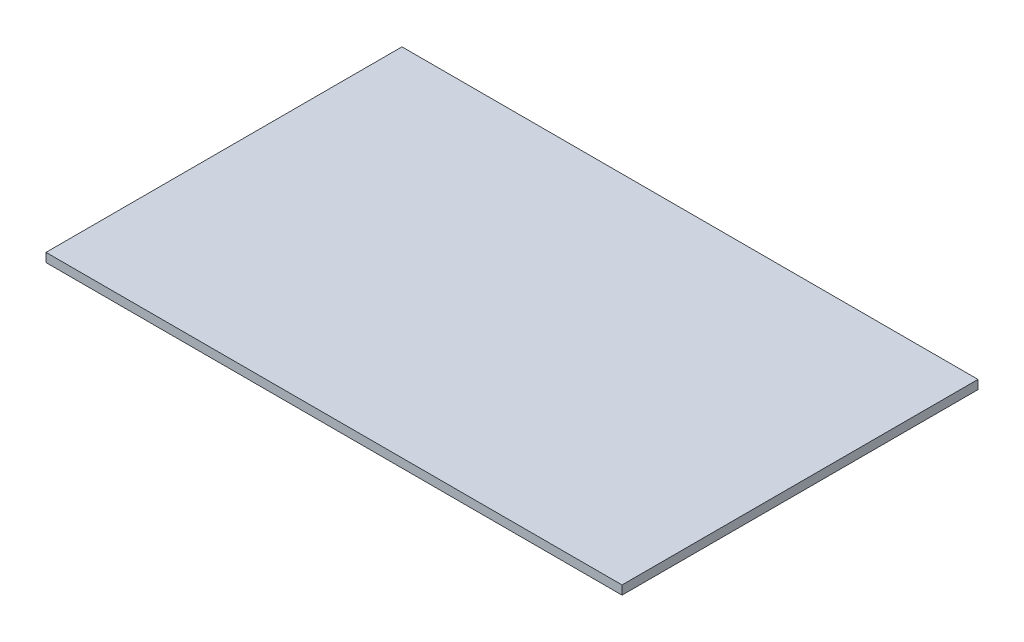
ISO-10303-21;
HEADER;
FILE_DESCRIPTION(('STEP AP214'),'2;1');
FILE_NAME('part.step','',(''),(''),'','','');
FILE_SCHEMA(('AUTOMOTIVE_DESIGN { 1 0 10303 214 1 1 1 1 }'));
ENDSEC;
DATA;
#1=APPLICATION_CONTEXT('core data for automotive mechanical design processes');
#2=APPLICATION_PROTOCOL_DEFINITION('international standard','automotive_design',2000,#1);
#3=PRODUCT_CONTEXT('',#1,'mechanical');
#4=PRODUCT('Part','Part','',(#3));
#5=PRODUCT_RELATED_PRODUCT_CATEGORY('part','',(#4));
#6=PRODUCT_DEFINITION_FORMATION('','',#4);
#7=PRODUCT_DEFINITION_CONTEXT('part definition',#1,'design');
#8=PRODUCT_DEFINITION('design','',#6,#7);
#9=PRODUCT_DEFINITION_SHAPE('','',#8);
#10=(LENGTH_UNIT() NAMED_UNIT(*) SI_UNIT(.MILLI.,.METRE.));
#11=(NAMED_UNIT(*) PLANE_ANGLE_UNIT() SI_UNIT($,.RADIAN.));
#12=(NAMED_UNIT(*) SI_UNIT($,.STERADIAN.) SOLID_ANGLE_UNIT());
#13=UNCERTAINTY_MEASURE_WITH_UNIT(LENGTH_MEASURE(1.E-05),#10,'distance_accuracy_value','');
#14=(GEOMETRIC_REPRESENTATION_CONTEXT(3) GLOBAL_UNCERTAINTY_ASSIGNED_CONTEXT((#13)) GLOBAL_UNIT_ASSIGNED_CONTEXT((#10,
#11,#12)) REPRESENTATION_CONTEXT('',''));
#15=CARTESIAN_POINT('',(0.,0.,0.));
#16=DIRECTION('',(0.,0.,1.));
#17=DIRECTION('',(1.,0.,0.));
#18=AXIS2_PLACEMENT_3D('',#15,#16,#17);
#19=CARTESIAN_POINT('',(0.,6.35,0.));
#20=DIRECTION('',(1.,0.,0.));
#21=DIRECTION('',(0.,0.,-1.));
#22=AXIS2_PLACEMENT_3D('',#19,#20,#21);
#23=PLANE('',#22);
#24=DIRECTION('',(0.,0.,1.));
#25=VECTOR('',#24,1.);
#26=CARTESIAN_POINT('',(0.,0.,0.));
#27=LINE('',#26,#25);
#28=CARTESIAN_POINT('',(0.,0.,-254.6));
#29=VERTEX_POINT('',#28);
#30=CARTESIAN_POINT('',(0.,0.,0.));
#31=VERTEX_POINT('',#30);
#32=EDGE_CURVE('E96',#29,#31,#27,.T.);
#33=ORIENTED_EDGE('',*,*,#32,.T.);
#34=DIRECTION('',(0.,-1.,0.));
#35=VECTOR('',#34,1.);
#36=CARTESIAN_POINT('',(0.,6.35,0.));
#37=LINE('',#36,#35);
#38=CARTESIAN_POINT('',(0.,6.35,0.));
#39=VERTEX_POINT('',#38);
#40=EDGE_CURVE('E11',#39,#31,#37,.T.);
#41=ORIENTED_EDGE('',*,*,#40,.F.);
#42=DIRECTION('',(0.,0.,1.));
#43=VECTOR('',#42,1.);
#44=CARTESIAN_POINT('',(0.,6.35,0.));
#45=LINE('',#44,#43);
#46=CARTESIAN_POINT('',(0.,6.35,-254.6));
#47=VERTEX_POINT('',#46);
#48=EDGE_CURVE('E84',#47,#39,#45,.T.);
#49=ORIENTED_EDGE('',*,*,#48,.F.);
#50=DIRECTION('',(0.,-1.,0.));
#51=VECTOR('',#50,1.);
#52=CARTESIAN_POINT('',(0.,6.35,-254.6));
#53=LINE('',#52,#51);
#54=EDGE_CURVE('E92',#47,#29,#53,.T.);
#55=ORIENTED_EDGE('',*,*,#54,.T.);
#56=EDGE_LOOP('',(#33,#41,#49,#55));
#57=FACE_BOUND('',#56,.T.);
#58=ADVANCED_FACE('F33',(#57),#23,.F.);
#59=CARTESIAN_POINT('',(0.,6.35,0.));
#60=DIRECTION('',(0.,0.,-1.));
#61=DIRECTION('',(-1.,0.,0.));
#62=AXIS2_PLACEMENT_3D('',#59,#60,#61);
#63=PLANE('',#62);
#64=DIRECTION('',(1.,0.,0.));
#65=VECTOR('',#64,1.);
#66=CARTESIAN_POINT('',(0.,0.,0.));
#67=LINE('',#66,#65);
#68=CARTESIAN_POINT('',(412.,0.,0.));
#69=VERTEX_POINT('',#68);
#70=EDGE_CURVE('E88',#31,#69,#67,.T.);
#71=ORIENTED_EDGE('',*,*,#70,.T.);
#72=DIRECTION('',(0.,-1.,0.));
#73=VECTOR('',#72,1.);
#74=CARTESIAN_POINT('',(412.,6.35,0.));
#75=LINE('',#74,#73);
#76=CARTESIAN_POINT('',(412.,6.35,0.));
#77=VERTEX_POINT('',#76);
#78=EDGE_CURVE('E41',#77,#69,#75,.T.);
#79=ORIENTED_EDGE('',*,*,#78,.F.);
#80=DIRECTION('',(1.,0.,0.));
#81=VECTOR('',#80,1.);
#82=CARTESIAN_POINT('',(0.,6.35,0.));
#83=LINE('',#82,#81);
#84=EDGE_CURVE('E79',#39,#77,#83,.T.);
#85=ORIENTED_EDGE('',*,*,#84,.F.);
#86=ORIENTED_EDGE('',*,*,#40,.T.);
#87=EDGE_LOOP('',(#71,#79,#85,#86));
#88=FACE_BOUND('',#87,.T.);
#89=ADVANCED_FACE('F87',(#88),#63,.F.);
#90=CARTESIAN_POINT('',(412.,6.35,0.));
#91=DIRECTION('',(-1.,0.,0.));
#92=DIRECTION('',(0.,0.,1.));
#93=AXIS2_PLACEMENT_3D('',#90,#91,#92);
#94=PLANE('',#93);
#95=DIRECTION('',(0.,0.,-1.));
#96=VECTOR('',#95,1.);
#97=CARTESIAN_POINT('',(412.,0.,0.));
#98=LINE('',#97,#96);
#99=CARTESIAN_POINT('',(412.,0.,-254.6));
#100=VERTEX_POINT('',#99);
#101=EDGE_CURVE('E66',#69,#100,#98,.T.);
#102=ORIENTED_EDGE('',*,*,#101,.T.);
#103=DIRECTION('',(0.,-1.,0.));
#104=VECTOR('',#103,1.);
#105=CARTESIAN_POINT('',(412.,6.35,-254.6));
#106=LINE('',#105,#104);
#107=CARTESIAN_POINT('',(412.,6.35,-254.6));
#108=VERTEX_POINT('',#107);
#109=EDGE_CURVE('E89',#108,#100,#106,.T.);
#110=ORIENTED_EDGE('',*,*,#109,.F.);
#111=DIRECTION('',(0.,0.,-1.));
#112=VECTOR('',#111,1.);
#113=CARTESIAN_POINT('',(412.,6.35,0.));
#114=LINE('',#113,#112);
#115=EDGE_CURVE('E82',#77,#108,#114,.T.);
#116=ORIENTED_EDGE('',*,*,#115,.F.);
#117=ORIENTED_EDGE('',*,*,#78,.T.);
#118=EDGE_LOOP('',(#102,#110,#116,#117));
#119=FACE_BOUND('',#118,.T.);
#120=ADVANCED_FACE('F90',(#119),#94,.F.);
#121=CARTESIAN_POINT('',(0.,6.35,-254.6));
#122=DIRECTION('',(0.,0.,1.));
#123=DIRECTION('',(1.,0.,0.));
#124=AXIS2_PLACEMENT_3D('',#121,#122,#123);
#125=PLANE('',#124);
#126=DIRECTION('',(-1.,0.,0.));
#127=VECTOR('',#126,1.);
#128=CARTESIAN_POINT('',(0.,0.,-254.6));
#129=LINE('',#128,#127);
#130=EDGE_CURVE('E72',#100,#29,#129,.T.);
#131=ORIENTED_EDGE('',*,*,#130,.T.);
#132=ORIENTED_EDGE('',*,*,#54,.F.);
#133=DIRECTION('',(-1.,0.,0.));
#134=VECTOR('',#133,1.);
#135=CARTESIAN_POINT('',(0.,6.35,-254.6));
#136=LINE('',#135,#134);
#137=EDGE_CURVE('E49',#108,#47,#136,.T.);
#138=ORIENTED_EDGE('',*,*,#137,.F.);
#139=ORIENTED_EDGE('',*,*,#109,.T.);
#140=EDGE_LOOP('',(#131,#132,#138,#139));
#141=FACE_BOUND('',#140,.T.);
#142=ADVANCED_FACE('F103',(#141),#125,.F.);
#143=CARTESIAN_POINT('',(0.,6.35,0.));
#144=DIRECTION('',(0.,-1.,0.));
#145=DIRECTION('',(0.,0.,-1.));
#146=AXIS2_PLACEMENT_3D('',#143,#144,#145);
#147=PLANE('',#146);
#148=ORIENTED_EDGE('',*,*,#48,.T.);
#149=ORIENTED_EDGE('',*,*,#84,.T.);
#150=ORIENTED_EDGE('',*,*,#115,.T.);
#151=ORIENTED_EDGE('',*,*,#137,.T.);
#152=EDGE_LOOP('',(#148,#149,#150,#151));
#153=FACE_BOUND('',#152,.T.);
#154=ADVANCED_FACE('F80',(#153),#147,.F.);
#155=CARTESIAN_POINT('',(0.,0.,0.));
#156=DIRECTION('',(0.,-1.,0.));
#157=DIRECTION('',(0.,0.,-1.));
#158=AXIS2_PLACEMENT_3D('',#155,#156,#157);
#159=PLANE('',#158);
#160=ORIENTED_EDGE('',*,*,#32,.F.);
#161=ORIENTED_EDGE('',*,*,#130,.F.);
#162=ORIENTED_EDGE('',*,*,#101,.F.);
#163=ORIENTED_EDGE('',*,*,#70,.F.);
#164=EDGE_LOOP('',(#160,#161,#162,#163));
#165=FACE_BOUND('',#164,.T.);
#166=ADVANCED_FACE('F106',(#165),#159,.T.);
#167=CLOSED_SHELL('',(#58,#89,#120,#142,#154,#166));
#168=MANIFOLD_SOLID_BREP('B2',#167);
#169=ADVANCED_BREP_SHAPE_REPRESENTATION('',(#18,#168),#14);
#170=SHAPE_DEFINITION_REPRESENTATION(#9,#169);
ENDSEC;
END-ISO-10303-21;
